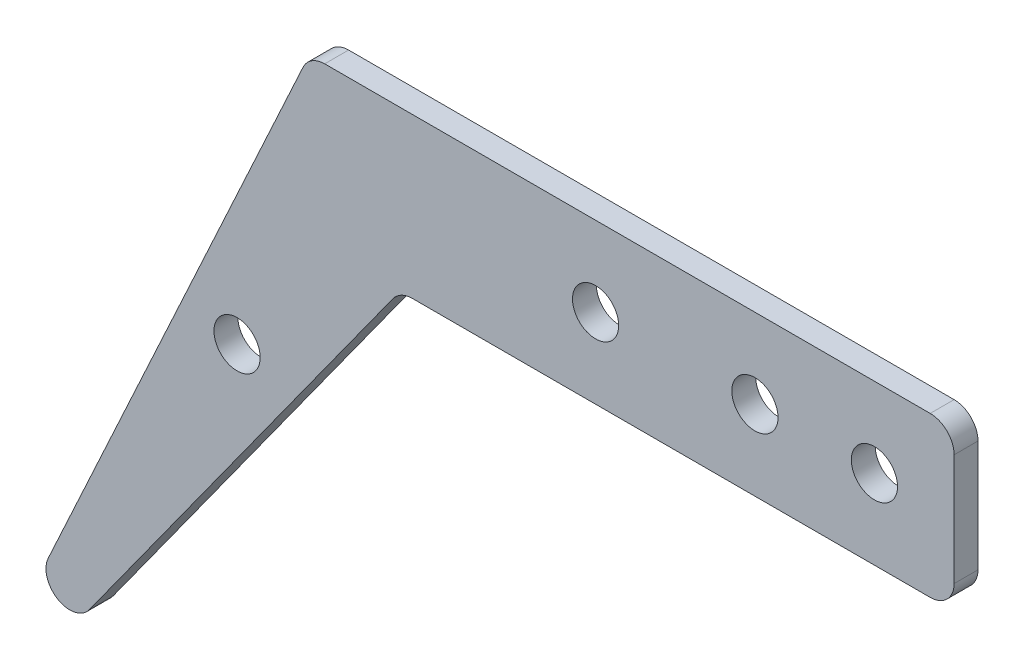
ISO-10303-21;
HEADER;
FILE_DESCRIPTION(('STEP AP214'),'2;1');
FILE_NAME('part.step','',(''),(''),'','','');
FILE_SCHEMA(('AUTOMOTIVE_DESIGN { 1 0 10303 214 1 1 1 1 }'));
ENDSEC;
DATA;
#1=APPLICATION_CONTEXT('core data for automotive mechanical design processes');
#2=APPLICATION_PROTOCOL_DEFINITION('international standard','automotive_design',2000,#1);
#3=PRODUCT_CONTEXT('',#1,'mechanical');
#4=PRODUCT('Part','Part','',(#3));
#5=PRODUCT_RELATED_PRODUCT_CATEGORY('part','',(#4));
#6=PRODUCT_DEFINITION_FORMATION('','',#4);
#7=PRODUCT_DEFINITION_CONTEXT('part definition',#1,'design');
#8=PRODUCT_DEFINITION('design','',#6,#7);
#9=PRODUCT_DEFINITION_SHAPE('','',#8);
#10=(LENGTH_UNIT() NAMED_UNIT(*) SI_UNIT(.MILLI.,.METRE.));
#11=(NAMED_UNIT(*) PLANE_ANGLE_UNIT() SI_UNIT($,.RADIAN.));
#12=(NAMED_UNIT(*) SI_UNIT($,.STERADIAN.) SOLID_ANGLE_UNIT());
#13=UNCERTAINTY_MEASURE_WITH_UNIT(LENGTH_MEASURE(1.E-05),#10,'distance_accuracy_value','');
#14=(GEOMETRIC_REPRESENTATION_CONTEXT(3) GLOBAL_UNCERTAINTY_ASSIGNED_CONTEXT((#13)) GLOBAL_UNIT_ASSIGNED_CONTEXT((#10,
#11,#12)) REPRESENTATION_CONTEXT('',''));
#15=CARTESIAN_POINT('',(0.,0.,0.));
#16=DIRECTION('',(0.,0.,1.));
#17=DIRECTION('',(1.,0.,0.));
#18=AXIS2_PLACEMENT_3D('',#15,#16,#17);
#19=CARTESIAN_POINT('',(72.,-7.00000000000003,-3.));
#20=DIRECTION('',(0.,0.,1.));
#21=DIRECTION('',(1.,0.,0.));
#22=AXIS2_PLACEMENT_3D('',#19,#20,#21);
#23=CYLINDRICAL_SURFACE('',#22,2.99999999999999);
#24=CARTESIAN_POINT('',(72.,-7.00000000000003,0.));
#25=DIRECTION('',(0.,0.,1.));
#26=DIRECTION('',(1.,0.,0.));
#27=AXIS2_PLACEMENT_3D('',#24,#25,#26);
#28=CIRCLE('',#27,2.99999999999999);
#29=CARTESIAN_POINT('',(72.,-10.,0.));
#30=VERTEX_POINT('',#29);
#31=CARTESIAN_POINT('',(75.,-7.00000000000003,0.));
#32=VERTEX_POINT('',#31);
#33=EDGE_CURVE('E147',#30,#32,#28,.T.);
#34=ORIENTED_EDGE('',*,*,#33,.F.);
#35=DIRECTION('',(0.,0.,1.));
#36=VECTOR('',#35,1.);
#37=CARTESIAN_POINT('',(72.,-10.,-3.));
#38=LINE('',#37,#36);
#39=CARTESIAN_POINT('',(72.,-10.,-3.));
#40=VERTEX_POINT('',#39);
#41=EDGE_CURVE('E11',#40,#30,#38,.T.);
#42=ORIENTED_EDGE('',*,*,#41,.F.);
#43=CARTESIAN_POINT('',(72.,-7.00000000000003,-3.));
#44=DIRECTION('',(0.,0.,1.));
#45=DIRECTION('',(1.,0.,0.));
#46=AXIS2_PLACEMENT_3D('',#43,#44,#45);
#47=CIRCLE('',#46,2.99999999999999);
#48=CARTESIAN_POINT('',(75.,-7.00000000000003,-3.));
#49=VERTEX_POINT('',#48);
#50=EDGE_CURVE('E174',#40,#49,#47,.T.);
#51=ORIENTED_EDGE('',*,*,#50,.T.);
#52=DIRECTION('',(0.,0.,1.));
#53=VECTOR('',#52,1.);
#54=CARTESIAN_POINT('',(75.,-7.00000000000003,-3.));
#55=LINE('',#54,#53);
#56=EDGE_CURVE('E99',#49,#32,#55,.T.);
#57=ORIENTED_EDGE('',*,*,#56,.T.);
#58=EDGE_LOOP('',(#34,#42,#51,#57));
#59=FACE_BOUND('',#58,.T.);
#60=ADVANCED_FACE('F37',(#59),#23,.T.);
#61=CARTESIAN_POINT('',(6.99999999999999,-10.,-3.));
#62=DIRECTION('',(0.,-1.,0.));
#63=DIRECTION('',(1.,0.,0.));
#64=AXIS2_PLACEMENT_3D('',#61,#62,#63);
#65=PLANE('',#64);
#66=DIRECTION('',(1.,0.,0.));
#67=VECTOR('',#66,1.);
#68=CARTESIAN_POINT('',(6.99999999999999,-10.,0.));
#69=LINE('',#68,#67);
#70=CARTESIAN_POINT('',(6.99999999999999,-10.,0.));
#71=VERTEX_POINT('',#70);
#72=EDGE_CURVE('E172',#71,#30,#69,.T.);
#73=ORIENTED_EDGE('',*,*,#72,.F.);
#74=DIRECTION('',(0.,0.,1.));
#75=VECTOR('',#74,1.);
#76=CARTESIAN_POINT('',(6.99999999999999,-10.,-3.));
#77=LINE('',#76,#75);
#78=CARTESIAN_POINT('',(6.99999999999999,-10.,-3.));
#79=VERTEX_POINT('',#78);
#80=EDGE_CURVE('E46',#79,#71,#77,.T.);
#81=ORIENTED_EDGE('',*,*,#80,.F.);
#82=DIRECTION('',(1.,0.,0.));
#83=VECTOR('',#82,1.);
#84=CARTESIAN_POINT('',(6.99999999999999,-10.,-3.));
#85=LINE('',#84,#83);
#86=EDGE_CURVE('E137',#79,#40,#85,.T.);
#87=ORIENTED_EDGE('',*,*,#86,.T.);
#88=ORIENTED_EDGE('',*,*,#41,.T.);
#89=EDGE_LOOP('',(#73,#81,#87,#88));
#90=FACE_BOUND('',#89,.T.);
#91=ADVANCED_FACE('F245',(#90),#65,.T.);
#92=CARTESIAN_POINT('',(6.99999999999999,-13.,-3.));
#93=DIRECTION('',(0.,0.,1.));
#94=DIRECTION('',(1.,0.,0.));
#95=AXIS2_PLACEMENT_3D('',#92,#93,#94);
#96=CYLINDRICAL_SURFACE('',#95,3.);
#97=CARTESIAN_POINT('',(6.99999999999999,-13.,0.));
#98=DIRECTION('',(0.,0.,-1.));
#99=DIRECTION('',(1.,0.,0.));
#100=AXIS2_PLACEMENT_3D('',#97,#98,#99);
#101=CIRCLE('',#100,3.);
#102=CARTESIAN_POINT('',(4.56657977755065,-11.2454442097857,0.));
#103=VERTEX_POINT('',#102);
#104=EDGE_CURVE('E124',#103,#71,#101,.T.);
#105=ORIENTED_EDGE('',*,*,#104,.F.);
#106=DIRECTION('',(0.,0.,1.));
#107=VECTOR('',#106,1.);
#108=CARTESIAN_POINT('',(4.56657977755065,-11.2454442097857,-3.));
#109=LINE('',#108,#107);
#110=CARTESIAN_POINT('',(4.56657977755065,-11.2454442097857,-3.));
#111=VERTEX_POINT('',#110);
#112=EDGE_CURVE('E119',#111,#103,#109,.T.);
#113=ORIENTED_EDGE('',*,*,#112,.F.);
#114=CARTESIAN_POINT('',(6.99999999999999,-13.,-3.));
#115=DIRECTION('',(0.,0.,-1.));
#116=DIRECTION('',(1.,0.,0.));
#117=AXIS2_PLACEMENT_3D('',#114,#115,#116);
#118=CIRCLE('',#117,3.);
#119=EDGE_CURVE('E122',#111,#79,#118,.T.);
#120=ORIENTED_EDGE('',*,*,#119,.T.);
#121=ORIENTED_EDGE('',*,*,#80,.T.);
#122=EDGE_LOOP('',(#105,#113,#120,#121));
#123=FACE_BOUND('',#122,.T.);
#124=ADVANCED_FACE('F121',(#123),#96,.F.);
#125=CARTESIAN_POINT('',(-33.5541167139016,-64.1156203840206,-3.));
#126=DIRECTION('',(0.811140074149785,-0.584851930071434,0.));
#127=DIRECTION('',(0.584851930071434,0.811140074149785,0.));
#128=AXIS2_PLACEMENT_3D('',#125,#126,#127);
#129=PLANE('',#128);
#130=DIRECTION('',(0.584851930071434,0.811140074149785,0.));
#131=VECTOR('',#130,1.);
#132=CARTESIAN_POINT('',(-33.5541167139016,-64.1156203840206,0.));
#133=LINE('',#132,#131);
#134=CARTESIAN_POINT('',(-33.5541167139016,-64.1156203840206,0.));
#135=VERTEX_POINT('',#134);
#136=EDGE_CURVE('E169',#135,#103,#133,.T.);
#137=ORIENTED_EDGE('',*,*,#136,.F.);
#138=DIRECTION('',(0.,0.,1.));
#139=VECTOR('',#138,1.);
#140=CARTESIAN_POINT('',(-33.5541167139016,-64.1156203840206,-3.));
#141=LINE('',#140,#139);
#142=CARTESIAN_POINT('',(-33.5541167139016,-64.1156203840206,-3.));
#143=VERTEX_POINT('',#142);
#144=EDGE_CURVE('E129',#143,#135,#141,.T.);
#145=ORIENTED_EDGE('',*,*,#144,.F.);
#146=DIRECTION('',(0.584851930071434,0.811140074149785,0.));
#147=VECTOR('',#146,1.);
#148=CARTESIAN_POINT('',(-33.5541167139016,-64.1156203840206,-3.));
#149=LINE('',#148,#147);
#150=EDGE_CURVE('E135',#143,#111,#149,.T.);
#151=ORIENTED_EDGE('',*,*,#150,.T.);
#152=ORIENTED_EDGE('',*,*,#112,.T.);
#153=EDGE_LOOP('',(#137,#145,#151,#152));
#154=FACE_BOUND('',#153,.T.);
#155=ADVANCED_FACE('F139',(#154),#129,.T.);
#156=CARTESIAN_POINT('',(-35.987536936351,-62.3610645938063,-3.));
#157=DIRECTION('',(0.,0.,1.));
#158=DIRECTION('',(1.,0.,0.));
#159=AXIS2_PLACEMENT_3D('',#156,#157,#158);
#160=CYLINDRICAL_SURFACE('',#159,3.);
#161=CARTESIAN_POINT('',(-35.987536936351,-62.3610645938063,0.));
#162=DIRECTION('',(0.,0.,1.));
#163=DIRECTION('',(-1.,0.,0.));
#164=AXIS2_PLACEMENT_3D('',#161,#162,#163);
#165=CIRCLE('',#164,3.);
#166=CARTESIAN_POINT('',(-38.7117924891594,-61.1047080827025,0.));
#167=VERTEX_POINT('',#166);
#168=EDGE_CURVE('E166',#167,#135,#165,.T.);
#169=ORIENTED_EDGE('',*,*,#168,.F.);
#170=DIRECTION('',(0.,0.,1.));
#171=VECTOR('',#170,1.);
#172=CARTESIAN_POINT('',(-38.7117924891594,-61.1047080827025,-3.));
#173=LINE('',#172,#171);
#174=CARTESIAN_POINT('',(-38.7117924891594,-61.1047080827025,-3.));
#175=VERTEX_POINT('',#174);
#176=EDGE_CURVE('E178',#175,#167,#173,.T.);
#177=ORIENTED_EDGE('',*,*,#176,.F.);
#178=CARTESIAN_POINT('',(-35.987536936351,-62.3610645938063,-3.));
#179=DIRECTION('',(0.,0.,1.));
#180=DIRECTION('',(-1.,0.,0.));
#181=AXIS2_PLACEMENT_3D('',#178,#179,#180);
#182=CIRCLE('',#181,3.);
#183=EDGE_CURVE('E140',#175,#143,#182,.T.);
#184=ORIENTED_EDGE('',*,*,#183,.T.);
#185=ORIENTED_EDGE('',*,*,#144,.T.);
#186=EDGE_LOOP('',(#169,#177,#184,#185));
#187=FACE_BOUND('',#186,.T.);
#188=ADVANCED_FACE('F258',(#187),#160,.T.);
#189=CARTESIAN_POINT('',(-6.72425555280836,8.25635651110376,-3.));
#190=DIRECTION('',(-0.908085184269454,0.418785503701252,0.));
#191=DIRECTION('',(-0.418785503701252,-0.908085184269454,0.));
#192=AXIS2_PLACEMENT_3D('',#189,#190,#191);
#193=PLANE('',#192);
#194=DIRECTION('',(-0.418785503701252,-0.908085184269454,0.));
#195=VECTOR('',#194,1.);
#196=CARTESIAN_POINT('',(-6.72425555280836,8.25635651110376,0.));
#197=LINE('',#196,#195);
#198=CARTESIAN_POINT('',(-6.72425555280836,8.25635651110376,0.));
#199=VERTEX_POINT('',#198);
#200=EDGE_CURVE('E163',#199,#167,#197,.T.);
#201=ORIENTED_EDGE('',*,*,#200,.F.);
#202=DIRECTION('',(0.,0.,1.));
#203=VECTOR('',#202,1.);
#204=CARTESIAN_POINT('',(-6.72425555280836,8.25635651110376,-3.));
#205=LINE('',#204,#203);
#206=CARTESIAN_POINT('',(-6.72425555280836,8.25635651110376,-3.));
#207=VERTEX_POINT('',#206);
#208=EDGE_CURVE('E180',#207,#199,#205,.T.);
#209=ORIENTED_EDGE('',*,*,#208,.F.);
#210=DIRECTION('',(-0.418785503701252,-0.908085184269454,0.));
#211=VECTOR('',#210,1.);
#212=CARTESIAN_POINT('',(-6.72425555280836,8.25635651110376,-3.));
#213=LINE('',#212,#211);
#214=EDGE_CURVE('E142',#207,#175,#213,.T.);
#215=ORIENTED_EDGE('',*,*,#214,.T.);
#216=ORIENTED_EDGE('',*,*,#176,.T.);
#217=EDGE_LOOP('',(#201,#209,#215,#216));
#218=FACE_BOUND('',#217,.T.);
#219=ADVANCED_FACE('F228',(#218),#193,.T.);
#220=CARTESIAN_POINT('',(-4.,7.,-3.));
#221=DIRECTION('',(0.,0.,1.));
#222=DIRECTION('',(1.,0.,0.));
#223=AXIS2_PLACEMENT_3D('',#220,#221,#222);
#224=CYLINDRICAL_SURFACE('',#223,3.);
#225=CARTESIAN_POINT('',(-4.,7.,0.));
#226=DIRECTION('',(0.,0.,1.));
#227=DIRECTION('',(-1.,0.,0.));
#228=AXIS2_PLACEMENT_3D('',#225,#226,#227);
#229=CIRCLE('',#228,3.);
#230=CARTESIAN_POINT('',(-4.,10.,0.));
#231=VERTEX_POINT('',#230);
#232=EDGE_CURVE('E160',#231,#199,#229,.T.);
#233=ORIENTED_EDGE('',*,*,#232,.F.);
#234=DIRECTION('',(0.,0.,1.));
#235=VECTOR('',#234,1.);
#236=CARTESIAN_POINT('',(-4.,10.,-3.));
#237=LINE('',#236,#235);
#238=CARTESIAN_POINT('',(-4.,10.,-3.));
#239=VERTEX_POINT('',#238);
#240=EDGE_CURVE('E182',#239,#231,#237,.T.);
#241=ORIENTED_EDGE('',*,*,#240,.F.);
#242=CARTESIAN_POINT('',(-4.,7.,-3.));
#243=DIRECTION('',(0.,0.,1.));
#244=DIRECTION('',(-1.,0.,0.));
#245=AXIS2_PLACEMENT_3D('',#242,#243,#244);
#246=CIRCLE('',#245,3.);
#247=EDGE_CURVE('E222',#239,#207,#246,.T.);
#248=ORIENTED_EDGE('',*,*,#247,.T.);
#249=ORIENTED_EDGE('',*,*,#208,.T.);
#250=EDGE_LOOP('',(#233,#241,#248,#249));
#251=FACE_BOUND('',#250,.T.);
#252=ADVANCED_FACE('F234',(#251),#224,.T.);
#253=CARTESIAN_POINT('',(-4.,10.,-3.));
#254=DIRECTION('',(0.,1.,0.));
#255=DIRECTION('',(-1.,0.,0.));
#256=AXIS2_PLACEMENT_3D('',#253,#254,#255);
#257=PLANE('',#256);
#258=DIRECTION('',(-1.,0.,0.));
#259=VECTOR('',#258,1.);
#260=CARTESIAN_POINT('',(-4.,10.,0.));
#261=LINE('',#260,#259);
#262=CARTESIAN_POINT('',(72.,10.,0.));
#263=VERTEX_POINT('',#262);
#264=EDGE_CURVE('E157',#263,#231,#261,.T.);
#265=ORIENTED_EDGE('',*,*,#264,.F.);
#266=DIRECTION('',(0.,0.,1.));
#267=VECTOR('',#266,1.);
#268=CARTESIAN_POINT('',(72.,10.,-3.));
#269=LINE('',#268,#267);
#270=CARTESIAN_POINT('',(72.,10.,-3.));
#271=VERTEX_POINT('',#270);
#272=EDGE_CURVE('E184',#271,#263,#269,.T.);
#273=ORIENTED_EDGE('',*,*,#272,.F.);
#274=DIRECTION('',(-1.,0.,0.));
#275=VECTOR('',#274,1.);
#276=CARTESIAN_POINT('',(-4.,10.,-3.));
#277=LINE('',#276,#275);
#278=EDGE_CURVE('E219',#271,#239,#277,.T.);
#279=ORIENTED_EDGE('',*,*,#278,.T.);
#280=ORIENTED_EDGE('',*,*,#240,.T.);
#281=EDGE_LOOP('',(#265,#273,#279,#280));
#282=FACE_BOUND('',#281,.T.);
#283=ADVANCED_FACE('F237',(#282),#257,.T.);
#284=CARTESIAN_POINT('',(72.,7.00000000000003,-3.));
#285=DIRECTION('',(0.,0.,1.));
#286=DIRECTION('',(1.,0.,0.));
#287=AXIS2_PLACEMENT_3D('',#284,#285,#286);
#288=CYLINDRICAL_SURFACE('',#287,2.99999999999999);
#289=CARTESIAN_POINT('',(72.,7.00000000000003,0.));
#290=DIRECTION('',(0.,0.,1.));
#291=DIRECTION('',(-1.,0.,0.));
#292=AXIS2_PLACEMENT_3D('',#289,#290,#291);
#293=CIRCLE('',#292,2.99999999999999);
#294=CARTESIAN_POINT('',(75.,7.00000000000003,0.));
#295=VERTEX_POINT('',#294);
#296=EDGE_CURVE('E154',#295,#263,#293,.T.);
#297=ORIENTED_EDGE('',*,*,#296,.F.);
#298=DIRECTION('',(0.,0.,1.));
#299=VECTOR('',#298,1.);
#300=CARTESIAN_POINT('',(75.,7.00000000000003,-3.));
#301=LINE('',#300,#299);
#302=CARTESIAN_POINT('',(75.,7.00000000000003,-3.));
#303=VERTEX_POINT('',#302);
#304=EDGE_CURVE('E186',#303,#295,#301,.T.);
#305=ORIENTED_EDGE('',*,*,#304,.F.);
#306=CARTESIAN_POINT('',(72.,7.00000000000003,-3.));
#307=DIRECTION('',(0.,0.,1.));
#308=DIRECTION('',(-1.,0.,0.));
#309=AXIS2_PLACEMENT_3D('',#306,#307,#308);
#310=CIRCLE('',#309,2.99999999999999);
#311=EDGE_CURVE('E216',#303,#271,#310,.T.);
#312=ORIENTED_EDGE('',*,*,#311,.T.);
#313=ORIENTED_EDGE('',*,*,#272,.T.);
#314=EDGE_LOOP('',(#297,#305,#312,#313));
#315=FACE_BOUND('',#314,.T.);
#316=ADVANCED_FACE('F241',(#315),#288,.T.);
#317=CARTESIAN_POINT('',(75.,-7.00000000000003,-3.));
#318=DIRECTION('',(1.,0.,0.));
#319=DIRECTION('',(0.,0.,-1.));
#320=AXIS2_PLACEMENT_3D('',#317,#318,#319);
#321=PLANE('',#320);
#322=DIRECTION('',(0.,1.,0.));
#323=VECTOR('',#322,1.);
#324=CARTESIAN_POINT('',(75.,-7.00000000000003,0.));
#325=LINE('',#324,#323);
#326=EDGE_CURVE('E150',#32,#295,#325,.T.);
#327=ORIENTED_EDGE('',*,*,#326,.F.);
#328=ORIENTED_EDGE('',*,*,#56,.F.);
#329=DIRECTION('',(0.,1.,0.));
#330=VECTOR('',#329,1.);
#331=CARTESIAN_POINT('',(75.,-7.00000000000003,-3.));
#332=LINE('',#331,#330);
#333=EDGE_CURVE('E214',#49,#303,#332,.T.);
#334=ORIENTED_EDGE('',*,*,#333,.T.);
#335=ORIENTED_EDGE('',*,*,#304,.T.);
#336=EDGE_LOOP('',(#327,#328,#334,#335));
#337=FACE_BOUND('',#336,.T.);
#338=ADVANCED_FACE('F242',(#337),#321,.T.);
#339=CARTESIAN_POINT('',(72.,-7.00000000000003,-3.));
#340=DIRECTION('',(0.,0.,1.));
#341=DIRECTION('',(1.,0.,0.));
#342=AXIS2_PLACEMENT_3D('',#339,#340,#341);
#343=PLANE('',#342);
#344=CARTESIAN_POINT('',(30.,0.,-3.));
#345=DIRECTION('',(0.,0.,1.));
#346=DIRECTION('',(1.,0.,0.));
#347=AXIS2_PLACEMENT_3D('',#344,#345,#346);
#348=CIRCLE('',#347,2.89999999999998);
#349=CARTESIAN_POINT('',(32.9,0.,-3.));
#350=VERTEX_POINT('',#349);
#351=EDGE_CURVE('E40',#350,#350,#348,.T.);
#352=ORIENTED_EDGE('',*,*,#351,.T.);
#353=EDGE_LOOP('',(#352));
#354=FACE_BOUND('',#353,.T.);
#355=CARTESIAN_POINT('',(-14.9999999999997,-25.980762113533,-3.));
#356=DIRECTION('',(0.,0.,1.));
#357=DIRECTION('',(1.,0.,0.));
#358=AXIS2_PLACEMENT_3D('',#355,#356,#357);
#359=CIRCLE('',#358,2.89999999999998);
#360=CARTESIAN_POINT('',(-12.0999999999997,-25.980762113533,-3.));
#361=VERTEX_POINT('',#360);
#362=EDGE_CURVE('E196',#361,#361,#359,.T.);
#363=ORIENTED_EDGE('',*,*,#362,.T.);
#364=EDGE_LOOP('',(#363));
#365=FACE_BOUND('',#364,.T.);
#366=CARTESIAN_POINT('',(50.,0.,-3.));
#367=DIRECTION('',(0.,0.,1.));
#368=DIRECTION('',(1.,0.,0.));
#369=AXIS2_PLACEMENT_3D('',#366,#367,#368);
#370=CIRCLE('',#369,2.89999999999998);
#371=CARTESIAN_POINT('',(52.9,0.,-3.));
#372=VERTEX_POINT('',#371);
#373=EDGE_CURVE('E193',#372,#372,#370,.T.);
#374=ORIENTED_EDGE('',*,*,#373,.T.);
#375=EDGE_LOOP('',(#374));
#376=FACE_BOUND('',#375,.T.);
#377=CARTESIAN_POINT('',(64.9999999999999,0.,-3.));
#378=DIRECTION('',(0.,0.,1.));
#379=DIRECTION('',(1.,0.,0.));
#380=AXIS2_PLACEMENT_3D('',#377,#378,#379);
#381=CIRCLE('',#380,2.89999999999998);
#382=CARTESIAN_POINT('',(67.8999999999999,0.,-3.));
#383=VERTEX_POINT('',#382);
#384=EDGE_CURVE('E151',#383,#383,#381,.T.);
#385=ORIENTED_EDGE('',*,*,#384,.T.);
#386=EDGE_LOOP('',(#385));
#387=FACE_BOUND('',#386,.T.);
#388=ORIENTED_EDGE('',*,*,#50,.F.);
#389=ORIENTED_EDGE('',*,*,#86,.F.);
#390=ORIENTED_EDGE('',*,*,#119,.F.);
#391=ORIENTED_EDGE('',*,*,#150,.F.);
#392=ORIENTED_EDGE('',*,*,#183,.F.);
#393=ORIENTED_EDGE('',*,*,#214,.F.);
#394=ORIENTED_EDGE('',*,*,#247,.F.);
#395=ORIENTED_EDGE('',*,*,#278,.F.);
#396=ORIENTED_EDGE('',*,*,#311,.F.);
#397=ORIENTED_EDGE('',*,*,#333,.F.);
#398=EDGE_LOOP('',(#388,#389,#390,#391,#392,#393,#394,#395,#396,#397));
#399=FACE_BOUND('',#398,.T.);
#400=ADVANCED_FACE('F133',(#354,#365,#376,#387,#399),#343,.F.);
#401=CARTESIAN_POINT('',(72.,-7.00000000000003,0.));
#402=DIRECTION('',(0.,0.,1.));
#403=DIRECTION('',(1.,0.,0.));
#404=AXIS2_PLACEMENT_3D('',#401,#402,#403);
#405=PLANE('',#404);
#406=CARTESIAN_POINT('',(30.,0.,0.));
#407=DIRECTION('',(0.,0.,1.));
#408=DIRECTION('',(1.,0.,0.));
#409=AXIS2_PLACEMENT_3D('',#406,#407,#408);
#410=CIRCLE('',#409,2.89999999999998);
#411=CARTESIAN_POINT('',(32.9,0.,0.));
#412=VERTEX_POINT('',#411);
#413=EDGE_CURVE('E198',#412,#412,#410,.T.);
#414=ORIENTED_EDGE('',*,*,#413,.F.);
#415=EDGE_LOOP('',(#414));
#416=FACE_BOUND('',#415,.T.);
#417=CARTESIAN_POINT('',(-14.9999999999997,-25.980762113533,0.));
#418=DIRECTION('',(0.,0.,1.));
#419=DIRECTION('',(1.,0.,0.));
#420=AXIS2_PLACEMENT_3D('',#417,#418,#419);
#421=CIRCLE('',#420,2.89999999999998);
#422=CARTESIAN_POINT('',(-12.0999999999997,-25.980762113533,0.));
#423=VERTEX_POINT('',#422);
#424=EDGE_CURVE('E195',#423,#423,#421,.T.);
#425=ORIENTED_EDGE('',*,*,#424,.F.);
#426=EDGE_LOOP('',(#425));
#427=FACE_BOUND('',#426,.T.);
#428=CARTESIAN_POINT('',(50.,0.,0.));
#429=DIRECTION('',(0.,0.,1.));
#430=DIRECTION('',(1.,0.,0.));
#431=AXIS2_PLACEMENT_3D('',#428,#429,#430);
#432=CIRCLE('',#431,2.89999999999998);
#433=CARTESIAN_POINT('',(52.9,0.,0.));
#434=VERTEX_POINT('',#433);
#435=EDGE_CURVE('E192',#434,#434,#432,.T.);
#436=ORIENTED_EDGE('',*,*,#435,.F.);
#437=EDGE_LOOP('',(#436));
#438=FACE_BOUND('',#437,.T.);
#439=CARTESIAN_POINT('',(64.9999999999999,0.,0.));
#440=DIRECTION('',(0.,0.,1.));
#441=DIRECTION('',(1.,0.,0.));
#442=AXIS2_PLACEMENT_3D('',#439,#440,#441);
#443=CIRCLE('',#442,2.89999999999998);
#444=CARTESIAN_POINT('',(67.8999999999999,0.,0.));
#445=VERTEX_POINT('',#444);
#446=EDGE_CURVE('E189',#445,#445,#443,.T.);
#447=ORIENTED_EDGE('',*,*,#446,.F.);
#448=EDGE_LOOP('',(#447));
#449=FACE_BOUND('',#448,.T.);
#450=ORIENTED_EDGE('',*,*,#33,.T.);
#451=ORIENTED_EDGE('',*,*,#326,.T.);
#452=ORIENTED_EDGE('',*,*,#296,.T.);
#453=ORIENTED_EDGE('',*,*,#264,.T.);
#454=ORIENTED_EDGE('',*,*,#232,.T.);
#455=ORIENTED_EDGE('',*,*,#200,.T.);
#456=ORIENTED_EDGE('',*,*,#168,.T.);
#457=ORIENTED_EDGE('',*,*,#136,.T.);
#458=ORIENTED_EDGE('',*,*,#104,.T.);
#459=ORIENTED_EDGE('',*,*,#72,.T.);
#460=EDGE_LOOP('',(#450,#451,#452,#453,#454,#455,#456,#457,#458,#459));
#461=FACE_BOUND('',#460,.T.);
#462=ADVANCED_FACE('F244',(#416,#427,#438,#449,#461),#405,.T.);
#463=CARTESIAN_POINT('',(64.9999999999999,0.,9.));
#464=DIRECTION('',(0.,0.,1.));
#465=DIRECTION('',(1.,0.,0.));
#466=AXIS2_PLACEMENT_3D('',#463,#464,#465);
#467=CYLINDRICAL_SURFACE('',#466,2.89999999999998);
#468=ORIENTED_EDGE('',*,*,#446,.T.);
#469=EDGE_LOOP('',(#468));
#470=FACE_BOUND('',#469,.T.);
#471=ORIENTED_EDGE('',*,*,#384,.F.);
#472=EDGE_LOOP('',(#471));
#473=FACE_BOUND('',#472,.T.);
#474=ADVANCED_FACE('F277',(#470,#473),#467,.F.);
#475=CARTESIAN_POINT('',(50.,0.,9.));
#476=DIRECTION('',(0.,0.,1.));
#477=DIRECTION('',(1.,0.,0.));
#478=AXIS2_PLACEMENT_3D('',#475,#476,#477);
#479=CYLINDRICAL_SURFACE('',#478,2.89999999999998);
#480=ORIENTED_EDGE('',*,*,#435,.T.);
#481=EDGE_LOOP('',(#480));
#482=FACE_BOUND('',#481,.T.);
#483=ORIENTED_EDGE('',*,*,#373,.F.);
#484=EDGE_LOOP('',(#483));
#485=FACE_BOUND('',#484,.T.);
#486=ADVANCED_FACE('F282',(#482,#485),#479,.F.);
#487=CARTESIAN_POINT('',(-14.9999999999997,-25.980762113533,9.));
#488=DIRECTION('',(0.,0.,1.));
#489=DIRECTION('',(1.,0.,0.));
#490=AXIS2_PLACEMENT_3D('',#487,#488,#489);
#491=CYLINDRICAL_SURFACE('',#490,2.89999999999998);
#492=ORIENTED_EDGE('',*,*,#424,.T.);
#493=EDGE_LOOP('',(#492));
#494=FACE_BOUND('',#493,.T.);
#495=ORIENTED_EDGE('',*,*,#362,.F.);
#496=EDGE_LOOP('',(#495));
#497=FACE_BOUND('',#496,.T.);
#498=ADVANCED_FACE('F286',(#494,#497),#491,.F.);
#499=CARTESIAN_POINT('',(30.,0.,9.));
#500=DIRECTION('',(0.,0.,1.));
#501=DIRECTION('',(1.,0.,0.));
#502=AXIS2_PLACEMENT_3D('',#499,#500,#501);
#503=CYLINDRICAL_SURFACE('',#502,2.89999999999998);
#504=ORIENTED_EDGE('',*,*,#413,.T.);
#505=EDGE_LOOP('',(#504));
#506=FACE_BOUND('',#505,.T.);
#507=ORIENTED_EDGE('',*,*,#351,.F.);
#508=EDGE_LOOP('',(#507));
#509=FACE_BOUND('',#508,.T.);
#510=ADVANCED_FACE('F290',(#506,#509),#503,.F.);
#511=CLOSED_SHELL('',(#60,#91,#124,#155,#188,#219,#252,#283,#316,#338,#400,#462,#474,#486,#498,#510));
#512=MANIFOLD_SOLID_BREP('B2',#511);
#513=ADVANCED_BREP_SHAPE_REPRESENTATION('',(#18,#512),#14);
#514=SHAPE_DEFINITION_REPRESENTATION(#9,#513);
ENDSEC;
END-ISO-10303-21;
